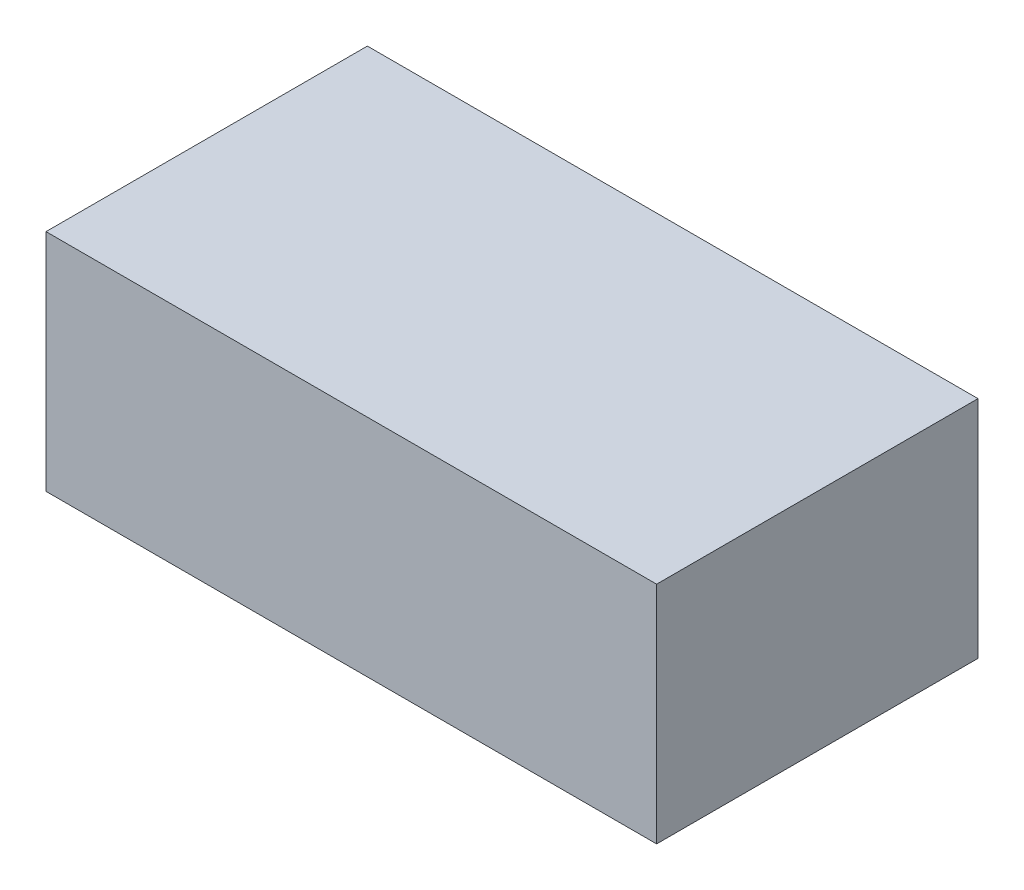
ISO-10303-21;
HEADER;
FILE_DESCRIPTION(('STEP AP214'),'2;1');
FILE_NAME('part.step','',(''),(''),'','','');
FILE_SCHEMA(('AUTOMOTIVE_DESIGN { 1 0 10303 214 1 1 1 1 }'));
ENDSEC;
DATA;
#1=APPLICATION_CONTEXT('core data for automotive mechanical design processes');
#2=APPLICATION_PROTOCOL_DEFINITION('international standard','automotive_design',2000,#1);
#3=PRODUCT_CONTEXT('',#1,'mechanical');
#4=PRODUCT('Part','Part','',(#3));
#5=PRODUCT_RELATED_PRODUCT_CATEGORY('part','',(#4));
#6=PRODUCT_DEFINITION_FORMATION('','',#4);
#7=PRODUCT_DEFINITION_CONTEXT('part definition',#1,'design');
#8=PRODUCT_DEFINITION('design','',#6,#7);
#9=PRODUCT_DEFINITION_SHAPE('','',#8);
#10=(LENGTH_UNIT() NAMED_UNIT(*) SI_UNIT(.MILLI.,.METRE.));
#11=(NAMED_UNIT(*) PLANE_ANGLE_UNIT() SI_UNIT($,.RADIAN.));
#12=(NAMED_UNIT(*) SI_UNIT($,.STERADIAN.) SOLID_ANGLE_UNIT());
#13=UNCERTAINTY_MEASURE_WITH_UNIT(LENGTH_MEASURE(1.E-05),#10,'distance_accuracy_value','');
#14=(GEOMETRIC_REPRESENTATION_CONTEXT(3) GLOBAL_UNCERTAINTY_ASSIGNED_CONTEXT((#13)) GLOBAL_UNIT_ASSIGNED_CONTEXT((#10,
#11,#12)) REPRESENTATION_CONTEXT('',''));
#15=CARTESIAN_POINT('',(0.,0.,0.));
#16=DIRECTION('',(0.,0.,1.));
#17=DIRECTION('',(1.,0.,0.));
#18=AXIS2_PLACEMENT_3D('',#15,#16,#17);
#19=CARTESIAN_POINT('',(24.13,17.78,12.7));
#20=DIRECTION('',(-1.,0.,0.));
#21=DIRECTION('',(0.,0.,1.));
#22=AXIS2_PLACEMENT_3D('',#19,#20,#21);
#23=PLANE('',#22);
#24=DIRECTION('',(0.,0.,-1.));
#25=VECTOR('',#24,1.);
#26=CARTESIAN_POINT('',(24.13,0.,12.7));
#27=LINE('',#26,#25);
#28=CARTESIAN_POINT('',(24.13,0.,12.7));
#29=VERTEX_POINT('',#28);
#30=CARTESIAN_POINT('',(24.13,0.,-12.7));
#31=VERTEX_POINT('',#30);
#32=EDGE_CURVE('E95',#29,#31,#27,.T.);
#33=ORIENTED_EDGE('',*,*,#32,.T.);
#34=DIRECTION('',(0.,-1.,0.));
#35=VECTOR('',#34,1.);
#36=CARTESIAN_POINT('',(24.13,17.78,-12.7));
#37=LINE('',#36,#35);
#38=CARTESIAN_POINT('',(24.13,17.78,-12.7));
#39=VERTEX_POINT('',#38);
#40=EDGE_CURVE('E11',#39,#31,#37,.T.);
#41=ORIENTED_EDGE('',*,*,#40,.F.);
#42=DIRECTION('',(0.,0.,-1.));
#43=VECTOR('',#42,1.);
#44=CARTESIAN_POINT('',(24.13,17.78,12.7));
#45=LINE('',#44,#43);
#46=CARTESIAN_POINT('',(24.13,17.78,12.7));
#47=VERTEX_POINT('',#46);
#48=EDGE_CURVE('E83',#47,#39,#45,.T.);
#49=ORIENTED_EDGE('',*,*,#48,.F.);
#50=DIRECTION('',(0.,-1.,0.));
#51=VECTOR('',#50,1.);
#52=CARTESIAN_POINT('',(24.13,17.78,12.7));
#53=LINE('',#52,#51);
#54=EDGE_CURVE('E91',#47,#29,#53,.T.);
#55=ORIENTED_EDGE('',*,*,#54,.T.);
#56=EDGE_LOOP('',(#33,#41,#49,#55));
#57=FACE_BOUND('',#56,.T.);
#58=ADVANCED_FACE('F32',(#57),#23,.F.);
#59=CARTESIAN_POINT('',(-24.13,17.78,-12.7));
#60=DIRECTION('',(0.,0.,1.));
#61=DIRECTION('',(1.,0.,0.));
#62=AXIS2_PLACEMENT_3D('',#59,#60,#61);
#63=PLANE('',#62);
#64=DIRECTION('',(-1.,0.,0.));
#65=VECTOR('',#64,1.);
#66=CARTESIAN_POINT('',(-24.13,0.,-12.7));
#67=LINE('',#66,#65);
#68=CARTESIAN_POINT('',(-24.13,0.,-12.7));
#69=VERTEX_POINT('',#68);
#70=EDGE_CURVE('E87',#31,#69,#67,.T.);
#71=ORIENTED_EDGE('',*,*,#70,.T.);
#72=DIRECTION('',(0.,-1.,0.));
#73=VECTOR('',#72,1.);
#74=CARTESIAN_POINT('',(-24.13,17.78,-12.7));
#75=LINE('',#74,#73);
#76=CARTESIAN_POINT('',(-24.13,17.78,-12.7));
#77=VERTEX_POINT('',#76);
#78=EDGE_CURVE('E40',#77,#69,#75,.T.);
#79=ORIENTED_EDGE('',*,*,#78,.F.);
#80=DIRECTION('',(-1.,0.,0.));
#81=VECTOR('',#80,1.);
#82=CARTESIAN_POINT('',(-24.13,17.78,-12.7));
#83=LINE('',#82,#81);
#84=EDGE_CURVE('E78',#39,#77,#83,.T.);
#85=ORIENTED_EDGE('',*,*,#84,.F.);
#86=ORIENTED_EDGE('',*,*,#40,.T.);
#87=EDGE_LOOP('',(#71,#79,#85,#86));
#88=FACE_BOUND('',#87,.T.);
#89=ADVANCED_FACE('F86',(#88),#63,.F.);
#90=CARTESIAN_POINT('',(-24.13,17.78,12.7));
#91=DIRECTION('',(1.,0.,0.));
#92=DIRECTION('',(0.,0.,-1.));
#93=AXIS2_PLACEMENT_3D('',#90,#91,#92);
#94=PLANE('',#93);
#95=DIRECTION('',(0.,0.,1.));
#96=VECTOR('',#95,1.);
#97=CARTESIAN_POINT('',(-24.13,0.,12.7));
#98=LINE('',#97,#96);
#99=CARTESIAN_POINT('',(-24.13,0.,12.7));
#100=VERTEX_POINT('',#99);
#101=EDGE_CURVE('E65',#69,#100,#98,.T.);
#102=ORIENTED_EDGE('',*,*,#101,.T.);
#103=DIRECTION('',(0.,-1.,0.));
#104=VECTOR('',#103,1.);
#105=CARTESIAN_POINT('',(-24.13,17.78,12.7));
#106=LINE('',#105,#104);
#107=CARTESIAN_POINT('',(-24.13,17.78,12.7));
#108=VERTEX_POINT('',#107);
#109=EDGE_CURVE('E88',#108,#100,#106,.T.);
#110=ORIENTED_EDGE('',*,*,#109,.F.);
#111=DIRECTION('',(0.,0.,1.));
#112=VECTOR('',#111,1.);
#113=CARTESIAN_POINT('',(-24.13,17.78,12.7));
#114=LINE('',#113,#112);
#115=EDGE_CURVE('E81',#77,#108,#114,.T.);
#116=ORIENTED_EDGE('',*,*,#115,.F.);
#117=ORIENTED_EDGE('',*,*,#78,.T.);
#118=EDGE_LOOP('',(#102,#110,#116,#117));
#119=FACE_BOUND('',#118,.T.);
#120=ADVANCED_FACE('F89',(#119),#94,.F.);
#121=CARTESIAN_POINT('',(-24.13,17.78,12.7));
#122=DIRECTION('',(0.,0.,-1.));
#123=DIRECTION('',(-1.,0.,0.));
#124=AXIS2_PLACEMENT_3D('',#121,#122,#123);
#125=PLANE('',#124);
#126=DIRECTION('',(1.,0.,0.));
#127=VECTOR('',#126,1.);
#128=CARTESIAN_POINT('',(-24.13,0.,12.7));
#129=LINE('',#128,#127);
#130=EDGE_CURVE('E71',#100,#29,#129,.T.);
#131=ORIENTED_EDGE('',*,*,#130,.T.);
#132=ORIENTED_EDGE('',*,*,#54,.F.);
#133=DIRECTION('',(1.,0.,0.));
#134=VECTOR('',#133,1.);
#135=CARTESIAN_POINT('',(-24.13,17.78,12.7));
#136=LINE('',#135,#134);
#137=EDGE_CURVE('E48',#108,#47,#136,.T.);
#138=ORIENTED_EDGE('',*,*,#137,.F.);
#139=ORIENTED_EDGE('',*,*,#109,.T.);
#140=EDGE_LOOP('',(#131,#132,#138,#139));
#141=FACE_BOUND('',#140,.T.);
#142=ADVANCED_FACE('F102',(#141),#125,.F.);
#143=CARTESIAN_POINT('',(0.,17.78,0.));
#144=DIRECTION('',(0.,-1.,0.));
#145=DIRECTION('',(0.,0.,-1.));
#146=AXIS2_PLACEMENT_3D('',#143,#144,#145);
#147=PLANE('',#146);
#148=ORIENTED_EDGE('',*,*,#48,.T.);
#149=ORIENTED_EDGE('',*,*,#84,.T.);
#150=ORIENTED_EDGE('',*,*,#115,.T.);
#151=ORIENTED_EDGE('',*,*,#137,.T.);
#152=EDGE_LOOP('',(#148,#149,#150,#151));
#153=FACE_BOUND('',#152,.T.);
#154=ADVANCED_FACE('F79',(#153),#147,.F.);
#155=CARTESIAN_POINT('',(0.,0.,0.));
#156=DIRECTION('',(0.,-1.,0.));
#157=DIRECTION('',(0.,0.,-1.));
#158=AXIS2_PLACEMENT_3D('',#155,#156,#157);
#159=PLANE('',#158);
#160=ORIENTED_EDGE('',*,*,#32,.F.);
#161=ORIENTED_EDGE('',*,*,#130,.F.);
#162=ORIENTED_EDGE('',*,*,#101,.F.);
#163=ORIENTED_EDGE('',*,*,#70,.F.);
#164=EDGE_LOOP('',(#160,#161,#162,#163));
#165=FACE_BOUND('',#164,.T.);
#166=ADVANCED_FACE('F105',(#165),#159,.T.);
#167=CLOSED_SHELL('',(#58,#89,#120,#142,#154,#166));
#168=MANIFOLD_SOLID_BREP('B2',#167);
#169=ADVANCED_BREP_SHAPE_REPRESENTATION('',(#18,#168),#14);
#170=SHAPE_DEFINITION_REPRESENTATION(#9,#169);
ENDSEC;
END-ISO-10303-21;
